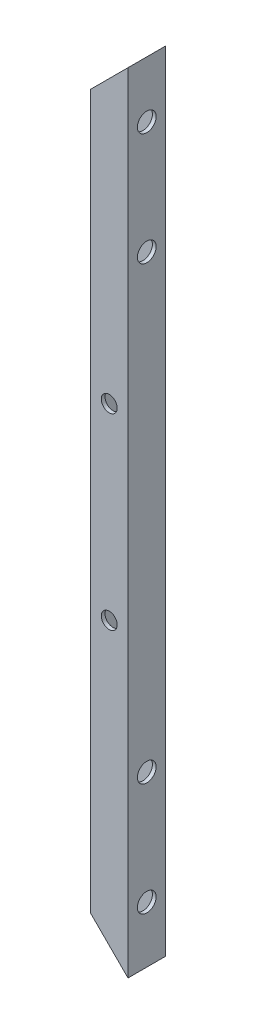
ISO-10303-21;
HEADER;
FILE_DESCRIPTION(('STEP AP214'),'2;1');
FILE_NAME('part.step','',(''),(''),'','','');
FILE_SCHEMA(('AUTOMOTIVE_DESIGN { 1 0 10303 214 1 1 1 1 }'));
ENDSEC;
DATA;
#1=APPLICATION_CONTEXT('core data for automotive mechanical design processes');
#2=APPLICATION_PROTOCOL_DEFINITION('international standard','automotive_design',2000,#1);
#3=PRODUCT_CONTEXT('',#1,'mechanical');
#4=PRODUCT('Part','Part','',(#3));
#5=PRODUCT_RELATED_PRODUCT_CATEGORY('part','',(#4));
#6=PRODUCT_DEFINITION_FORMATION('','',#4);
#7=PRODUCT_DEFINITION_CONTEXT('part definition',#1,'design');
#8=PRODUCT_DEFINITION('design','',#6,#7);
#9=PRODUCT_DEFINITION_SHAPE('','',#8);
#10=(LENGTH_UNIT() NAMED_UNIT(*) SI_UNIT(.MILLI.,.METRE.));
#11=(NAMED_UNIT(*) PLANE_ANGLE_UNIT() SI_UNIT($,.RADIAN.));
#12=(NAMED_UNIT(*) SI_UNIT($,.STERADIAN.) SOLID_ANGLE_UNIT());
#13=UNCERTAINTY_MEASURE_WITH_UNIT(LENGTH_MEASURE(1.E-05),#10,'distance_accuracy_value','');
#14=(GEOMETRIC_REPRESENTATION_CONTEXT(3) GLOBAL_UNCERTAINTY_ASSIGNED_CONTEXT((#13)) GLOBAL_UNIT_ASSIGNED_CONTEXT((#10,
#11,#12)) REPRESENTATION_CONTEXT('',''));
#15=CARTESIAN_POINT('',(0.,0.,0.));
#16=DIRECTION('',(0.,0.,1.));
#17=DIRECTION('',(1.,0.,0.));
#18=AXIS2_PLACEMENT_3D('',#15,#16,#17);
#19=CARTESIAN_POINT('',(-4.,210.,4.));
#20=DIRECTION('',(0.,0.,-1.));
#21=DIRECTION('',(-1.,0.,0.));
#22=AXIS2_PLACEMENT_3D('',#19,#20,#21);
#23=PLANE('',#22);
#24=CARTESIAN_POINT('',(0.,130.,4.));
#25=DIRECTION('',(0.,0.,-1.));
#26=DIRECTION('',(-1.,0.,0.));
#27=AXIS2_PLACEMENT_3D('',#24,#25,#26);
#28=CIRCLE('',#27,2.125);
#29=CARTESIAN_POINT('',(-2.12499999999999,130.,4.));
#30=VERTEX_POINT('',#29);
#31=EDGE_CURVE('E267',#30,#30,#28,.T.);
#32=ORIENTED_EDGE('',*,*,#31,.F.);
#33=EDGE_LOOP('',(#32));
#34=FACE_BOUND('',#33,.T.);
#35=CARTESIAN_POINT('',(0.,80.,4.));
#36=DIRECTION('',(0.,0.,-1.));
#37=DIRECTION('',(-1.,0.,0.));
#38=AXIS2_PLACEMENT_3D('',#35,#36,#37);
#39=CIRCLE('',#38,2.125);
#40=CARTESIAN_POINT('',(-2.12499999999998,80.,4.));
#41=VERTEX_POINT('',#40);
#42=EDGE_CURVE('E286',#41,#41,#39,.T.);
#43=ORIENTED_EDGE('',*,*,#42,.F.);
#44=EDGE_LOOP('',(#43));
#45=FACE_BOUND('',#44,.T.);
#46=DIRECTION('',(-0.707106781186551,-0.707106781186544,0.));
#47=VECTOR('',#46,1.);
#48=CARTESIAN_POINT('',(0.499999999999952,205.5,4.));
#49=LINE('',#48,#47);
#50=CARTESIAN_POINT('',(4.,209.,4.));
#51=VERTEX_POINT('',#50);
#52=CARTESIAN_POINT('',(-4.,201.,4.));
#53=VERTEX_POINT('',#52);
#54=EDGE_CURVE('E11',#51,#53,#49,.T.);
#55=ORIENTED_EDGE('',*,*,#54,.F.);
#56=DIRECTION('',(0.,-1.,0.));
#57=VECTOR('',#56,1.);
#58=CARTESIAN_POINT('',(4.,210.,4.));
#59=LINE('',#58,#57);
#60=CARTESIAN_POINT('',(4.00000000000002,1.,4.));
#61=VERTEX_POINT('',#60);
#62=EDGE_CURVE('E151',#51,#61,#59,.T.);
#63=ORIENTED_EDGE('',*,*,#62,.T.);
#64=DIRECTION('',(0.707106781186551,-0.707106781186544,0.));
#65=VECTOR('',#64,1.);
#66=CARTESIAN_POINT('',(-104.5,109.499999999999,4.));
#67=LINE('',#66,#65);
#68=CARTESIAN_POINT('',(-4.,8.99999999999993,4.));
#69=VERTEX_POINT('',#68);
#70=EDGE_CURVE('E47',#69,#61,#67,.T.);
#71=ORIENTED_EDGE('',*,*,#70,.F.);
#72=DIRECTION('',(0.,-1.,0.));
#73=VECTOR('',#72,1.);
#74=CARTESIAN_POINT('',(-4.,210.,4.));
#75=LINE('',#74,#73);
#76=EDGE_CURVE('E156',#53,#69,#75,.T.);
#77=ORIENTED_EDGE('',*,*,#76,.F.);
#78=EDGE_LOOP('',(#55,#63,#71,#77));
#79=FACE_BOUND('',#78,.T.);
#80=ADVANCED_FACE('F39',(#34,#45,#79),#23,.T.);
#81=CARTESIAN_POINT('',(-4.,210.,-4.));
#82=DIRECTION('',(1.,0.,0.));
#83=DIRECTION('',(0.,0.,-1.));
#84=AXIS2_PLACEMENT_3D('',#81,#82,#83);
#85=PLANE('',#84);
#86=CARTESIAN_POINT('',(-4.,15.,-2.48065457064683E-13));
#87=DIRECTION('',(1.,0.,0.));
#88=DIRECTION('',(0.,0.,-1.));
#89=AXIS2_PLACEMENT_3D('',#86,#87,#88);
#90=CIRCLE('',#89,2.50000000000001);
#91=CARTESIAN_POINT('',(-4.,15.,-2.50000000000026));
#92=VERTEX_POINT('',#91);
#93=EDGE_CURVE('E231',#92,#92,#90,.T.);
#94=ORIENTED_EDGE('',*,*,#93,.F.);
#95=EDGE_LOOP('',(#94));
#96=FACE_BOUND('',#95,.T.);
#97=CARTESIAN_POINT('',(-4.,195.,0.));
#98=DIRECTION('',(1.,0.,0.));
#99=DIRECTION('',(0.,0.,-1.));
#100=AXIS2_PLACEMENT_3D('',#97,#98,#99);
#101=CIRCLE('',#100,2.5);
#102=CARTESIAN_POINT('',(-4.,195.,-2.5));
#103=VERTEX_POINT('',#102);
#104=EDGE_CURVE('E238',#103,#103,#101,.T.);
#105=ORIENTED_EDGE('',*,*,#104,.F.);
#106=EDGE_LOOP('',(#105));
#107=FACE_BOUND('',#106,.T.);
#108=CARTESIAN_POINT('',(-4.,45.,0.));
#109=DIRECTION('',(1.,0.,0.));
#110=DIRECTION('',(0.,0.,-1.));
#111=AXIS2_PLACEMENT_3D('',#108,#109,#110);
#112=CIRCLE('',#111,2.5);
#113=CARTESIAN_POINT('',(-4.,45.,-2.49999999999998));
#114=VERTEX_POINT('',#113);
#115=EDGE_CURVE('E244',#114,#114,#112,.T.);
#116=ORIENTED_EDGE('',*,*,#115,.F.);
#117=EDGE_LOOP('',(#116));
#118=FACE_BOUND('',#117,.T.);
#119=CARTESIAN_POINT('',(-4.,165.,0.));
#120=DIRECTION('',(1.,0.,0.));
#121=DIRECTION('',(0.,0.,-1.));
#122=AXIS2_PLACEMENT_3D('',#119,#120,#121);
#123=CIRCLE('',#122,2.5);
#124=CARTESIAN_POINT('',(-4.,165.,-2.5));
#125=VERTEX_POINT('',#124);
#126=EDGE_CURVE('E250',#125,#125,#123,.T.);
#127=ORIENTED_EDGE('',*,*,#126,.F.);
#128=EDGE_LOOP('',(#127));
#129=FACE_BOUND('',#128,.T.);
#130=DIRECTION('',(0.,0.,-1.));
#131=VECTOR('',#130,1.);
#132=CARTESIAN_POINT('',(-4.,201.,-4.));
#133=LINE('',#132,#131);
#134=CARTESIAN_POINT('',(-4.,201.,-4.));
#135=VERTEX_POINT('',#134);
#136=EDGE_CURVE('E153',#53,#135,#133,.T.);
#137=ORIENTED_EDGE('',*,*,#136,.F.);
#138=ORIENTED_EDGE('',*,*,#76,.T.);
#139=DIRECTION('',(0.,0.,1.));
#140=VECTOR('',#139,1.);
#141=CARTESIAN_POINT('',(-4.,8.99999999999993,-4.));
#142=LINE('',#141,#140);
#143=CARTESIAN_POINT('',(-4.,8.99999999999993,-4.));
#144=VERTEX_POINT('',#143);
#145=EDGE_CURVE('E142',#144,#69,#142,.T.);
#146=ORIENTED_EDGE('',*,*,#145,.F.);
#147=DIRECTION('',(0.,-1.,0.));
#148=VECTOR('',#147,1.);
#149=CARTESIAN_POINT('',(-4.,210.,-4.));
#150=LINE('',#149,#148);
#151=EDGE_CURVE('E158',#135,#144,#150,.T.);
#152=ORIENTED_EDGE('',*,*,#151,.F.);
#153=EDGE_LOOP('',(#137,#138,#146,#152));
#154=FACE_BOUND('',#153,.T.);
#155=ADVANCED_FACE('F170',(#96,#107,#118,#129,#154),#85,.T.);
#156=CARTESIAN_POINT('',(-4.,210.,-4.));
#157=DIRECTION('',(0.,0.,1.));
#158=DIRECTION('',(1.,0.,0.));
#159=AXIS2_PLACEMENT_3D('',#156,#157,#158);
#160=PLANE('',#159);
#161=CARTESIAN_POINT('',(0.,130.,-4.));
#162=DIRECTION('',(0.,0.,1.));
#163=DIRECTION('',(1.,0.,0.));
#164=AXIS2_PLACEMENT_3D('',#161,#162,#163);
#165=CIRCLE('',#164,2.125);
#166=CARTESIAN_POINT('',(2.12500000000001,130.,-4.));
#167=VERTEX_POINT('',#166);
#168=EDGE_CURVE('E283',#167,#167,#165,.T.);
#169=ORIENTED_EDGE('',*,*,#168,.F.);
#170=EDGE_LOOP('',(#169));
#171=FACE_BOUND('',#170,.T.);
#172=CARTESIAN_POINT('',(0.,80.,-4.));
#173=DIRECTION('',(0.,0.,1.));
#174=DIRECTION('',(1.,0.,0.));
#175=AXIS2_PLACEMENT_3D('',#172,#173,#174);
#176=CIRCLE('',#175,2.125);
#177=CARTESIAN_POINT('',(2.12500000000002,80.,-4.));
#178=VERTEX_POINT('',#177);
#179=EDGE_CURVE('E289',#178,#178,#176,.T.);
#180=ORIENTED_EDGE('',*,*,#179,.F.);
#181=EDGE_LOOP('',(#180));
#182=FACE_BOUND('',#181,.T.);
#183=DIRECTION('',(0.707106781186551,0.707106781186544,0.));
#184=VECTOR('',#183,1.);
#185=CARTESIAN_POINT('',(0.499999999999952,205.5,-4.));
#186=LINE('',#185,#184);
#187=CARTESIAN_POINT('',(4.,209.,-4.));
#188=VERTEX_POINT('',#187);
#189=EDGE_CURVE('E160',#135,#188,#186,.T.);
#190=ORIENTED_EDGE('',*,*,#189,.F.);
#191=ORIENTED_EDGE('',*,*,#151,.T.);
#192=DIRECTION('',(-0.707106781186551,0.707106781186544,0.));
#193=VECTOR('',#192,1.);
#194=CARTESIAN_POINT('',(-104.5,109.499999999999,-4.));
#195=LINE('',#194,#193);
#196=CARTESIAN_POINT('',(4.00000000000002,1.,-4.));
#197=VERTEX_POINT('',#196);
#198=EDGE_CURVE('E154',#197,#144,#195,.T.);
#199=ORIENTED_EDGE('',*,*,#198,.F.);
#200=DIRECTION('',(0.,-1.,0.));
#201=VECTOR('',#200,1.);
#202=CARTESIAN_POINT('',(4.,210.,-4.));
#203=LINE('',#202,#201);
#204=EDGE_CURVE('E125',#188,#197,#203,.T.);
#205=ORIENTED_EDGE('',*,*,#204,.F.);
#206=EDGE_LOOP('',(#190,#191,#199,#205));
#207=FACE_BOUND('',#206,.T.);
#208=ADVANCED_FACE('F167',(#171,#182,#207),#160,.T.);
#209=CARTESIAN_POINT('',(4.,210.,-4.));
#210=DIRECTION('',(-1.,0.,0.));
#211=DIRECTION('',(0.,0.,1.));
#212=AXIS2_PLACEMENT_3D('',#209,#210,#211);
#213=PLANE('',#212);
#214=CARTESIAN_POINT('',(4.,15.,-2.48065457064683E-13));
#215=DIRECTION('',(-1.,0.,0.));
#216=DIRECTION('',(0.,0.,1.));
#217=AXIS2_PLACEMENT_3D('',#214,#215,#216);
#218=CIRCLE('',#217,2.50000000000001);
#219=CARTESIAN_POINT('',(4.,15.,2.49999999999976));
#220=VERTEX_POINT('',#219);
#221=EDGE_CURVE('E235',#220,#220,#218,.T.);
#222=ORIENTED_EDGE('',*,*,#221,.F.);
#223=EDGE_LOOP('',(#222));
#224=FACE_BOUND('',#223,.T.);
#225=CARTESIAN_POINT('',(4.,195.,0.));
#226=DIRECTION('',(-1.,0.,0.));
#227=DIRECTION('',(0.,0.,1.));
#228=AXIS2_PLACEMENT_3D('',#225,#226,#227);
#229=CIRCLE('',#228,2.5);
#230=CARTESIAN_POINT('',(4.,195.,2.5));
#231=VERTEX_POINT('',#230);
#232=EDGE_CURVE('E241',#231,#231,#229,.T.);
#233=ORIENTED_EDGE('',*,*,#232,.F.);
#234=EDGE_LOOP('',(#233));
#235=FACE_BOUND('',#234,.T.);
#236=CARTESIAN_POINT('',(4.,45.,0.));
#237=DIRECTION('',(-1.,0.,0.));
#238=DIRECTION('',(0.,0.,1.));
#239=AXIS2_PLACEMENT_3D('',#236,#237,#238);
#240=CIRCLE('',#239,2.5);
#241=CARTESIAN_POINT('',(4.,45.,2.50000000000002));
#242=VERTEX_POINT('',#241);
#243=EDGE_CURVE('E247',#242,#242,#240,.T.);
#244=ORIENTED_EDGE('',*,*,#243,.F.);
#245=EDGE_LOOP('',(#244));
#246=FACE_BOUND('',#245,.T.);
#247=CARTESIAN_POINT('',(4.,165.,0.));
#248=DIRECTION('',(-1.,0.,0.));
#249=DIRECTION('',(0.,0.,1.));
#250=AXIS2_PLACEMENT_3D('',#247,#248,#249);
#251=CIRCLE('',#250,2.5);
#252=CARTESIAN_POINT('',(4.,165.,2.50000000000001));
#253=VERTEX_POINT('',#252);
#254=EDGE_CURVE('E253',#253,#253,#251,.T.);
#255=ORIENTED_EDGE('',*,*,#254,.F.);
#256=EDGE_LOOP('',(#255));
#257=FACE_BOUND('',#256,.T.);
#258=DIRECTION('',(0.,0.,1.));
#259=VECTOR('',#258,1.);
#260=CARTESIAN_POINT('',(4.,209.,-4.));
#261=LINE('',#260,#259);
#262=EDGE_CURVE('E61',#188,#51,#261,.T.);
#263=ORIENTED_EDGE('',*,*,#262,.F.);
#264=ORIENTED_EDGE('',*,*,#204,.T.);
#265=DIRECTION('',(0.,0.,-1.));
#266=VECTOR('',#265,1.);
#267=CARTESIAN_POINT('',(4.,0.999999999999973,-4.));
#268=LINE('',#267,#266);
#269=EDGE_CURVE('E139',#61,#197,#268,.T.);
#270=ORIENTED_EDGE('',*,*,#269,.F.);
#271=ORIENTED_EDGE('',*,*,#62,.F.);
#272=EDGE_LOOP('',(#263,#264,#270,#271));
#273=FACE_BOUND('',#272,.T.);
#274=ADVANCED_FACE('F150',(#224,#235,#246,#257,#273),#213,.T.);
#275=CARTESIAN_POINT('',(5.,0.,5.));
#276=DIRECTION('',(0.707106781186544,0.707106781186551,0.));
#277=DIRECTION('',(-0.707106781186551,0.707106781186544,0.));
#278=AXIS2_PLACEMENT_3D('',#275,#276,#277);
#279=PLANE('',#278);
#280=ORIENTED_EDGE('',*,*,#269,.T.);
#281=ORIENTED_EDGE('',*,*,#198,.T.);
#282=ORIENTED_EDGE('',*,*,#145,.T.);
#283=ORIENTED_EDGE('',*,*,#70,.T.);
#284=EDGE_LOOP('',(#280,#281,#282,#283));
#285=FACE_BOUND('',#284,.T.);
#286=DIRECTION('',(0.707106781186551,-0.707106781186544,0.));
#287=VECTOR('',#286,1.);
#288=CARTESIAN_POINT('',(5.,0.,-5.));
#289=LINE('',#288,#287);
#290=CARTESIAN_POINT('',(-4.99999999999998,9.99999999999987,-5.));
#291=VERTEX_POINT('',#290);
#292=CARTESIAN_POINT('',(5.,0.,-5.));
#293=VERTEX_POINT('',#292);
#294=EDGE_CURVE('E226',#291,#293,#289,.T.);
#295=ORIENTED_EDGE('',*,*,#294,.T.);
#296=DIRECTION('',(0.,0.,-1.));
#297=VECTOR('',#296,1.);
#298=CARTESIAN_POINT('',(5.,0.,-5.));
#299=LINE('',#298,#297);
#300=CARTESIAN_POINT('',(5.,0.,5.));
#301=VERTEX_POINT('',#300);
#302=EDGE_CURVE('E123',#301,#293,#299,.T.);
#303=ORIENTED_EDGE('',*,*,#302,.F.);
#304=DIRECTION('',(0.707106781186551,-0.707106781186544,0.));
#305=VECTOR('',#304,1.);
#306=CARTESIAN_POINT('',(5.,0.,5.));
#307=LINE('',#306,#305);
#308=CARTESIAN_POINT('',(-4.99999999999998,9.99999999999987,5.));
#309=VERTEX_POINT('',#308);
#310=EDGE_CURVE('E115',#309,#301,#307,.T.);
#311=ORIENTED_EDGE('',*,*,#310,.F.);
#312=DIRECTION('',(0.,0.,-1.));
#313=VECTOR('',#312,1.);
#314=CARTESIAN_POINT('',(-4.99999999999998,9.99999999999987,5.));
#315=LINE('',#314,#313);
#316=EDGE_CURVE('E175',#309,#291,#315,.T.);
#317=ORIENTED_EDGE('',*,*,#316,.T.);
#318=EDGE_LOOP('',(#295,#303,#311,#317));
#319=FACE_BOUND('',#318,.T.);
#320=ADVANCED_FACE('F137',(#285,#319),#279,.F.);
#321=CARTESIAN_POINT('',(5.,210.,5.));
#322=DIRECTION('',(0.707106781186544,-0.707106781186551,0.));
#323=DIRECTION('',(0.707106781186551,0.707106781186544,0.));
#324=AXIS2_PLACEMENT_3D('',#321,#322,#323);
#325=PLANE('',#324);
#326=ORIENTED_EDGE('',*,*,#262,.T.);
#327=ORIENTED_EDGE('',*,*,#54,.T.);
#328=ORIENTED_EDGE('',*,*,#136,.T.);
#329=ORIENTED_EDGE('',*,*,#189,.T.);
#330=EDGE_LOOP('',(#326,#327,#328,#329));
#331=FACE_BOUND('',#330,.T.);
#332=DIRECTION('',(-0.707106781186551,-0.707106781186544,0.));
#333=VECTOR('',#332,1.);
#334=CARTESIAN_POINT('',(5.,210.,-5.));
#335=LINE('',#334,#333);
#336=CARTESIAN_POINT('',(5.,210.,-5.));
#337=VERTEX_POINT('',#336);
#338=CARTESIAN_POINT('',(-4.99999999999998,200.,-5.));
#339=VERTEX_POINT('',#338);
#340=EDGE_CURVE('E109',#337,#339,#335,.T.);
#341=ORIENTED_EDGE('',*,*,#340,.T.);
#342=DIRECTION('',(0.,0.,-1.));
#343=VECTOR('',#342,1.);
#344=CARTESIAN_POINT('',(-4.99999999999998,200.,5.));
#345=LINE('',#344,#343);
#346=CARTESIAN_POINT('',(-5.,200.,5.));
#347=VERTEX_POINT('',#346);
#348=EDGE_CURVE('E54',#347,#339,#345,.T.);
#349=ORIENTED_EDGE('',*,*,#348,.F.);
#350=DIRECTION('',(-0.707106781186551,-0.707106781186544,0.));
#351=VECTOR('',#350,1.);
#352=CARTESIAN_POINT('',(5.,210.,5.));
#353=LINE('',#352,#351);
#354=CARTESIAN_POINT('',(5.,210.,5.));
#355=VERTEX_POINT('',#354);
#356=EDGE_CURVE('E100',#355,#347,#353,.T.);
#357=ORIENTED_EDGE('',*,*,#356,.F.);
#358=DIRECTION('',(0.,0.,-1.));
#359=VECTOR('',#358,1.);
#360=CARTESIAN_POINT('',(5.,210.,-5.));
#361=LINE('',#360,#359);
#362=EDGE_CURVE('E104',#355,#337,#361,.T.);
#363=ORIENTED_EDGE('',*,*,#362,.T.);
#364=EDGE_LOOP('',(#341,#349,#357,#363));
#365=FACE_BOUND('',#364,.T.);
#366=ADVANCED_FACE('F102',(#331,#365),#325,.F.);
#367=CARTESIAN_POINT('',(5.,210.,-5.));
#368=DIRECTION('',(-1.,0.,0.));
#369=DIRECTION('',(0.,0.,1.));
#370=AXIS2_PLACEMENT_3D('',#367,#368,#369);
#371=PLANE('',#370);
#372=CARTESIAN_POINT('',(5.,15.,-2.48065457064683E-13));
#373=DIRECTION('',(-1.,0.,0.));
#374=DIRECTION('',(0.,0.,-1.));
#375=AXIS2_PLACEMENT_3D('',#372,#373,#374);
#376=CIRCLE('',#375,2.50000000000001);
#377=CARTESIAN_POINT('',(5.,15.,-2.50000000000026));
#378=VERTEX_POINT('',#377);
#379=EDGE_CURVE('E266',#378,#378,#376,.T.);
#380=ORIENTED_EDGE('',*,*,#379,.T.);
#381=EDGE_LOOP('',(#380));
#382=FACE_BOUND('',#381,.T.);
#383=CARTESIAN_POINT('',(5.,195.,0.));
#384=DIRECTION('',(-1.,0.,0.));
#385=DIRECTION('',(0.,0.,1.));
#386=AXIS2_PLACEMENT_3D('',#383,#384,#385);
#387=CIRCLE('',#386,2.5);
#388=CARTESIAN_POINT('',(5.,195.,2.5));
#389=VERTEX_POINT('',#388);
#390=EDGE_CURVE('E273',#389,#389,#387,.T.);
#391=ORIENTED_EDGE('',*,*,#390,.T.);
#392=EDGE_LOOP('',(#391));
#393=FACE_BOUND('',#392,.T.);
#394=CARTESIAN_POINT('',(5.,45.,0.));
#395=DIRECTION('',(-1.,0.,0.));
#396=DIRECTION('',(0.,0.,-1.));
#397=AXIS2_PLACEMENT_3D('',#394,#395,#396);
#398=CIRCLE('',#397,2.5);
#399=CARTESIAN_POINT('',(5.,45.,-2.49999999999998));
#400=VERTEX_POINT('',#399);
#401=EDGE_CURVE('E260',#400,#400,#398,.T.);
#402=ORIENTED_EDGE('',*,*,#401,.T.);
#403=EDGE_LOOP('',(#402));
#404=FACE_BOUND('',#403,.T.);
#405=CARTESIAN_POINT('',(5.,165.,0.));
#406=DIRECTION('',(-1.,0.,0.));
#407=DIRECTION('',(0.,0.,1.));
#408=AXIS2_PLACEMENT_3D('',#405,#406,#407);
#409=CIRCLE('',#408,2.5);
#410=CARTESIAN_POINT('',(5.,165.,2.50000000000001));
#411=VERTEX_POINT('',#410);
#412=EDGE_CURVE('E256',#411,#411,#409,.T.);
#413=ORIENTED_EDGE('',*,*,#412,.T.);
#414=EDGE_LOOP('',(#413));
#415=FACE_BOUND('',#414,.T.);
#416=ORIENTED_EDGE('',*,*,#302,.T.);
#417=DIRECTION('',(0.,-1.,0.));
#418=VECTOR('',#417,1.);
#419=CARTESIAN_POINT('',(5.,210.,-5.));
#420=LINE('',#419,#418);
#421=EDGE_CURVE('E122',#337,#293,#420,.T.);
#422=ORIENTED_EDGE('',*,*,#421,.F.);
#423=ORIENTED_EDGE('',*,*,#362,.F.);
#424=DIRECTION('',(0.,-1.,0.));
#425=VECTOR('',#424,1.);
#426=CARTESIAN_POINT('',(5.,210.,5.));
#427=LINE('',#426,#425);
#428=EDGE_CURVE('E113',#355,#301,#427,.T.);
#429=ORIENTED_EDGE('',*,*,#428,.T.);
#430=EDGE_LOOP('',(#416,#422,#423,#429));
#431=FACE_BOUND('',#430,.T.);
#432=ADVANCED_FACE('F41',(#382,#393,#404,#415,#431),#371,.F.);
#433=CARTESIAN_POINT('',(-5.,210.,-5.));
#434=DIRECTION('',(0.,0.,1.));
#435=DIRECTION('',(1.,0.,0.));
#436=AXIS2_PLACEMENT_3D('',#433,#434,#435);
#437=PLANE('',#436);
#438=CARTESIAN_POINT('',(0.,130.,-5.));
#439=DIRECTION('',(0.,0.,1.));
#440=DIRECTION('',(1.,0.,0.));
#441=AXIS2_PLACEMENT_3D('',#438,#439,#440);
#442=CIRCLE('',#441,2.125);
#443=CARTESIAN_POINT('',(2.12500000000001,130.,-5.));
#444=VERTEX_POINT('',#443);
#445=EDGE_CURVE('E219',#444,#444,#442,.T.);
#446=ORIENTED_EDGE('',*,*,#445,.T.);
#447=EDGE_LOOP('',(#446));
#448=FACE_BOUND('',#447,.T.);
#449=CARTESIAN_POINT('',(0.,80.,-5.));
#450=DIRECTION('',(0.,0.,1.));
#451=DIRECTION('',(-1.,0.,0.));
#452=AXIS2_PLACEMENT_3D('',#449,#450,#451);
#453=CIRCLE('',#452,2.125);
#454=CARTESIAN_POINT('',(-2.12499999999998,80.,-5.));
#455=VERTEX_POINT('',#454);
#456=EDGE_CURVE('E223',#455,#455,#453,.T.);
#457=ORIENTED_EDGE('',*,*,#456,.T.);
#458=EDGE_LOOP('',(#457));
#459=FACE_BOUND('',#458,.T.);
#460=DIRECTION('',(0.,-1.,0.));
#461=VECTOR('',#460,1.);
#462=CARTESIAN_POINT('',(-5.,210.,-5.));
#463=LINE('',#462,#461);
#464=EDGE_CURVE('E131',#339,#291,#463,.T.);
#465=ORIENTED_EDGE('',*,*,#464,.F.);
#466=ORIENTED_EDGE('',*,*,#340,.F.);
#467=ORIENTED_EDGE('',*,*,#421,.T.);
#468=ORIENTED_EDGE('',*,*,#294,.F.);
#469=EDGE_LOOP('',(#465,#466,#467,#468));
#470=FACE_BOUND('',#469,.T.);
#471=ADVANCED_FACE('F184',(#448,#459,#470),#437,.F.);
#472=CARTESIAN_POINT('',(-5.,210.,-5.));
#473=DIRECTION('',(1.,0.,0.));
#474=DIRECTION('',(0.,0.,-1.));
#475=AXIS2_PLACEMENT_3D('',#472,#473,#474);
#476=PLANE('',#475);
#477=CARTESIAN_POINT('',(-5.,15.,-2.48065457064683E-13));
#478=DIRECTION('',(-1.,0.,0.));
#479=DIRECTION('',(0.,0.,-1.));
#480=AXIS2_PLACEMENT_3D('',#477,#478,#479);
#481=CIRCLE('',#480,2.50000000000001);
#482=CARTESIAN_POINT('',(-5.,15.,-2.50000000000026));
#483=VERTEX_POINT('',#482);
#484=EDGE_CURVE('E263',#483,#483,#481,.T.);
#485=ORIENTED_EDGE('',*,*,#484,.F.);
#486=EDGE_LOOP('',(#485));
#487=FACE_BOUND('',#486,.T.);
#488=CARTESIAN_POINT('',(-5.,195.,0.));
#489=DIRECTION('',(-1.,0.,0.));
#490=DIRECTION('',(0.,0.,1.));
#491=AXIS2_PLACEMENT_3D('',#488,#489,#490);
#492=CIRCLE('',#491,2.5);
#493=CARTESIAN_POINT('',(-5.,195.,2.5));
#494=VERTEX_POINT('',#493);
#495=EDGE_CURVE('E270',#494,#494,#492,.T.);
#496=ORIENTED_EDGE('',*,*,#495,.F.);
#497=EDGE_LOOP('',(#496));
#498=FACE_BOUND('',#497,.T.);
#499=CARTESIAN_POINT('',(-5.,45.,0.));
#500=DIRECTION('',(-1.,0.,0.));
#501=DIRECTION('',(0.,0.,-1.));
#502=AXIS2_PLACEMENT_3D('',#499,#500,#501);
#503=CIRCLE('',#502,2.5);
#504=CARTESIAN_POINT('',(-5.,45.,-2.49999999999998));
#505=VERTEX_POINT('',#504);
#506=EDGE_CURVE('E276',#505,#505,#503,.T.);
#507=ORIENTED_EDGE('',*,*,#506,.F.);
#508=EDGE_LOOP('',(#507));
#509=FACE_BOUND('',#508,.T.);
#510=CARTESIAN_POINT('',(-5.,165.,0.));
#511=DIRECTION('',(-1.,0.,0.));
#512=DIRECTION('',(0.,0.,1.));
#513=AXIS2_PLACEMENT_3D('',#510,#511,#512);
#514=CIRCLE('',#513,2.5);
#515=CARTESIAN_POINT('',(-5.,165.,2.50000000000001));
#516=VERTEX_POINT('',#515);
#517=EDGE_CURVE('E257',#516,#516,#514,.T.);
#518=ORIENTED_EDGE('',*,*,#517,.F.);
#519=EDGE_LOOP('',(#518));
#520=FACE_BOUND('',#519,.T.);
#521=DIRECTION('',(0.,-1.,0.));
#522=VECTOR('',#521,1.);
#523=CARTESIAN_POINT('',(-5.,210.,5.));
#524=LINE('',#523,#522);
#525=EDGE_CURVE('E118',#347,#309,#524,.T.);
#526=ORIENTED_EDGE('',*,*,#525,.F.);
#527=ORIENTED_EDGE('',*,*,#348,.T.);
#528=ORIENTED_EDGE('',*,*,#464,.T.);
#529=ORIENTED_EDGE('',*,*,#316,.F.);
#530=EDGE_LOOP('',(#526,#527,#528,#529));
#531=FACE_BOUND('',#530,.T.);
#532=ADVANCED_FACE('F208',(#487,#498,#509,#520,#531),#476,.F.);
#533=CARTESIAN_POINT('',(-5.,210.,5.));
#534=DIRECTION('',(0.,0.,-1.));
#535=DIRECTION('',(-1.,0.,0.));
#536=AXIS2_PLACEMENT_3D('',#533,#534,#535);
#537=PLANE('',#536);
#538=CARTESIAN_POINT('',(0.,130.,5.));
#539=DIRECTION('',(0.,0.,1.));
#540=DIRECTION('',(1.,0.,0.));
#541=AXIS2_PLACEMENT_3D('',#538,#539,#540);
#542=CIRCLE('',#541,2.125);
#543=CARTESIAN_POINT('',(2.12500000000001,130.,5.));
#544=VERTEX_POINT('',#543);
#545=EDGE_CURVE('E296',#544,#544,#542,.T.);
#546=ORIENTED_EDGE('',*,*,#545,.F.);
#547=EDGE_LOOP('',(#546));
#548=FACE_BOUND('',#547,.T.);
#549=CARTESIAN_POINT('',(0.,80.,5.));
#550=DIRECTION('',(0.,0.,1.));
#551=DIRECTION('',(-1.,0.,0.));
#552=AXIS2_PLACEMENT_3D('',#549,#550,#551);
#553=CIRCLE('',#552,2.125);
#554=CARTESIAN_POINT('',(-2.12499999999998,80.,5.));
#555=VERTEX_POINT('',#554);
#556=EDGE_CURVE('E292',#555,#555,#553,.T.);
#557=ORIENTED_EDGE('',*,*,#556,.F.);
#558=EDGE_LOOP('',(#557));
#559=FACE_BOUND('',#558,.T.);
#560=ORIENTED_EDGE('',*,*,#428,.F.);
#561=ORIENTED_EDGE('',*,*,#356,.T.);
#562=ORIENTED_EDGE('',*,*,#525,.T.);
#563=ORIENTED_EDGE('',*,*,#310,.T.);
#564=EDGE_LOOP('',(#560,#561,#562,#563));
#565=FACE_BOUND('',#564,.T.);
#566=ADVANCED_FACE('F114',(#548,#559,#565),#537,.F.);
#567=CARTESIAN_POINT('',(5.,165.,0.));
#568=DIRECTION('',(-1.,0.,0.));
#569=DIRECTION('',(0.,0.,1.));
#570=AXIS2_PLACEMENT_3D('',#567,#568,#569);
#571=CYLINDRICAL_SURFACE('',#570,2.5);
#572=ORIENTED_EDGE('',*,*,#126,.T.);
#573=EDGE_LOOP('',(#572));
#574=FACE_BOUND('',#573,.T.);
#575=ORIENTED_EDGE('',*,*,#517,.T.);
#576=EDGE_LOOP('',(#575));
#577=FACE_BOUND('',#576,.T.);
#578=ADVANCED_FACE('F207',(#574,#577),#571,.F.);
#579=CARTESIAN_POINT('',(5.,45.,0.));
#580=DIRECTION('',(-1.,0.,0.));
#581=DIRECTION('',(0.,0.,1.));
#582=AXIS2_PLACEMENT_3D('',#579,#580,#581);
#583=CYLINDRICAL_SURFACE('',#582,2.5);
#584=ORIENTED_EDGE('',*,*,#115,.T.);
#585=EDGE_LOOP('',(#584));
#586=FACE_BOUND('',#585,.T.);
#587=ORIENTED_EDGE('',*,*,#506,.T.);
#588=EDGE_LOOP('',(#587));
#589=FACE_BOUND('',#588,.T.);
#590=ADVANCED_FACE('F404',(#586,#589),#583,.F.);
#591=CARTESIAN_POINT('',(5.,195.,0.));
#592=DIRECTION('',(-1.,0.,0.));
#593=DIRECTION('',(0.,0.,1.));
#594=AXIS2_PLACEMENT_3D('',#591,#592,#593);
#595=CYLINDRICAL_SURFACE('',#594,2.5);
#596=ORIENTED_EDGE('',*,*,#104,.T.);
#597=EDGE_LOOP('',(#596));
#598=FACE_BOUND('',#597,.T.);
#599=ORIENTED_EDGE('',*,*,#495,.T.);
#600=EDGE_LOOP('',(#599));
#601=FACE_BOUND('',#600,.T.);
#602=ADVANCED_FACE('F394',(#598,#601),#595,.F.);
#603=CARTESIAN_POINT('',(5.,15.,-2.48065457064683E-13));
#604=DIRECTION('',(-1.,0.,0.));
#605=DIRECTION('',(0.,0.,1.));
#606=AXIS2_PLACEMENT_3D('',#603,#604,#605);
#607=CYLINDRICAL_SURFACE('',#606,2.50000000000001);
#608=ORIENTED_EDGE('',*,*,#93,.T.);
#609=EDGE_LOOP('',(#608));
#610=FACE_BOUND('',#609,.T.);
#611=ORIENTED_EDGE('',*,*,#484,.T.);
#612=EDGE_LOOP('',(#611));
#613=FACE_BOUND('',#612,.T.);
#614=ADVANCED_FACE('F321',(#610,#613),#607,.F.);
#615=ORIENTED_EDGE('',*,*,#254,.T.);
#616=EDGE_LOOP('',(#615));
#617=FACE_BOUND('',#616,.T.);
#618=ORIENTED_EDGE('',*,*,#412,.F.);
#619=EDGE_LOOP('',(#618));
#620=FACE_BOUND('',#619,.T.);
#621=ADVANCED_FACE('F402',(#617,#620),#571,.F.);
#622=ORIENTED_EDGE('',*,*,#243,.T.);
#623=EDGE_LOOP('',(#622));
#624=FACE_BOUND('',#623,.T.);
#625=ORIENTED_EDGE('',*,*,#401,.F.);
#626=EDGE_LOOP('',(#625));
#627=FACE_BOUND('',#626,.T.);
#628=ADVANCED_FACE('F391',(#624,#627),#583,.F.);
#629=ORIENTED_EDGE('',*,*,#232,.T.);
#630=EDGE_LOOP('',(#629));
#631=FACE_BOUND('',#630,.T.);
#632=ORIENTED_EDGE('',*,*,#390,.F.);
#633=EDGE_LOOP('',(#632));
#634=FACE_BOUND('',#633,.T.);
#635=ADVANCED_FACE('F318',(#631,#634),#595,.F.);
#636=ORIENTED_EDGE('',*,*,#221,.T.);
#637=EDGE_LOOP('',(#636));
#638=FACE_BOUND('',#637,.T.);
#639=ORIENTED_EDGE('',*,*,#379,.F.);
#640=EDGE_LOOP('',(#639));
#641=FACE_BOUND('',#640,.T.);
#642=ADVANCED_FACE('F307',(#638,#641),#607,.F.);
#643=CARTESIAN_POINT('',(0.,80.,-5.));
#644=DIRECTION('',(0.,0.,1.));
#645=DIRECTION('',(1.,0.,0.));
#646=AXIS2_PLACEMENT_3D('',#643,#644,#645);
#647=CYLINDRICAL_SURFACE('',#646,2.125);
#648=ORIENTED_EDGE('',*,*,#42,.T.);
#649=EDGE_LOOP('',(#648));
#650=FACE_BOUND('',#649,.T.);
#651=ORIENTED_EDGE('',*,*,#556,.T.);
#652=EDGE_LOOP('',(#651));
#653=FACE_BOUND('',#652,.T.);
#654=ADVANCED_FACE('F305',(#650,#653),#647,.F.);
#655=CARTESIAN_POINT('',(0.,130.,-5.));
#656=DIRECTION('',(0.,0.,1.));
#657=DIRECTION('',(1.,0.,0.));
#658=AXIS2_PLACEMENT_3D('',#655,#656,#657);
#659=CYLINDRICAL_SURFACE('',#658,2.125);
#660=ORIENTED_EDGE('',*,*,#31,.T.);
#661=EDGE_LOOP('',(#660));
#662=FACE_BOUND('',#661,.T.);
#663=ORIENTED_EDGE('',*,*,#545,.T.);
#664=EDGE_LOOP('',(#663));
#665=FACE_BOUND('',#664,.T.);
#666=ADVANCED_FACE('F301',(#662,#665),#659,.F.);
#667=ORIENTED_EDGE('',*,*,#179,.T.);
#668=EDGE_LOOP('',(#667));
#669=FACE_BOUND('',#668,.T.);
#670=ORIENTED_EDGE('',*,*,#456,.F.);
#671=EDGE_LOOP('',(#670));
#672=FACE_BOUND('',#671,.T.);
#673=ADVANCED_FACE('F310',(#669,#672),#647,.F.);
#674=ORIENTED_EDGE('',*,*,#168,.T.);
#675=EDGE_LOOP('',(#674));
#676=FACE_BOUND('',#675,.T.);
#677=ORIENTED_EDGE('',*,*,#445,.F.);
#678=EDGE_LOOP('',(#677));
#679=FACE_BOUND('',#678,.T.);
#680=ADVANCED_FACE('F317',(#676,#679),#659,.F.);
#681=CLOSED_SHELL('',(#80,#155,#208,#274,#320,#366,#432,#471,#532,#566,#578,#590,#602,#614,#621,
#628,#635,#642,#654,#666,#673,#680));
#682=MANIFOLD_SOLID_BREP('B2',#681);
#683=ADVANCED_BREP_SHAPE_REPRESENTATION('',(#18,#682),#14);
#684=SHAPE_DEFINITION_REPRESENTATION(#9,#683);
ENDSEC;
END-ISO-10303-21;
